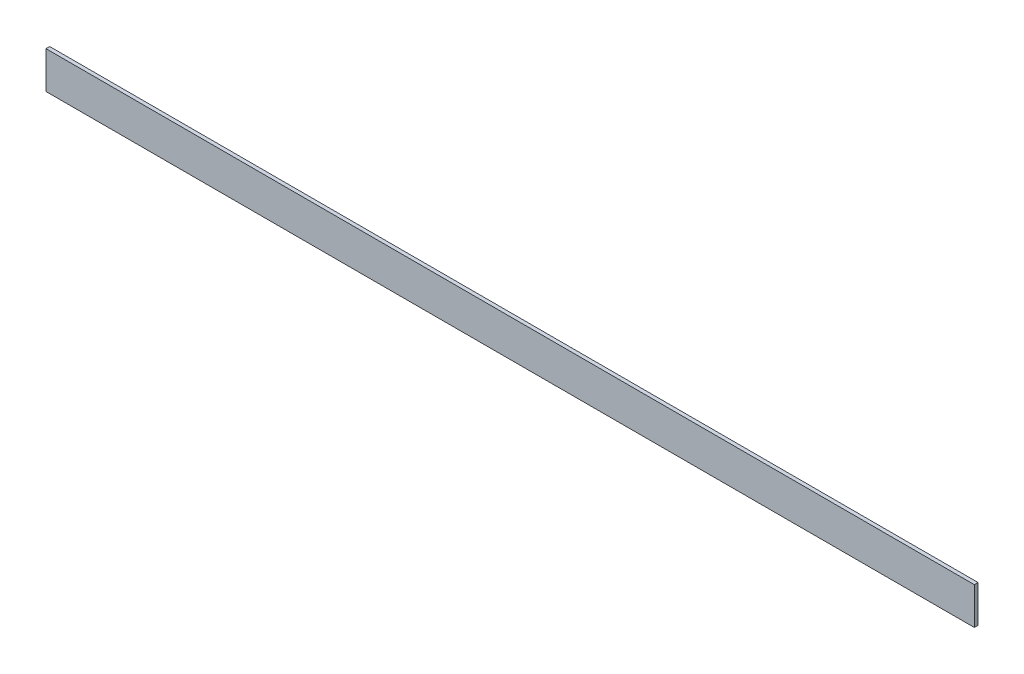
ISO-10303-21;
HEADER;
FILE_DESCRIPTION(('STEP AP214'),'2;1');
FILE_NAME('part.step','',(''),(''),'','','');
FILE_SCHEMA(('AUTOMOTIVE_DESIGN { 1 0 10303 214 1 1 1 1 }'));
ENDSEC;
DATA;
#1=APPLICATION_CONTEXT('core data for automotive mechanical design processes');
#2=APPLICATION_PROTOCOL_DEFINITION('international standard','automotive_design',2000,#1);
#3=PRODUCT_CONTEXT('',#1,'mechanical');
#4=PRODUCT('Part','Part','',(#3));
#5=PRODUCT_RELATED_PRODUCT_CATEGORY('part','',(#4));
#6=PRODUCT_DEFINITION_FORMATION('','',#4);
#7=PRODUCT_DEFINITION_CONTEXT('part definition',#1,'design');
#8=PRODUCT_DEFINITION('design','',#6,#7);
#9=PRODUCT_DEFINITION_SHAPE('','',#8);
#10=(LENGTH_UNIT() NAMED_UNIT(*) SI_UNIT(.MILLI.,.METRE.));
#11=(NAMED_UNIT(*) PLANE_ANGLE_UNIT() SI_UNIT($,.RADIAN.));
#12=(NAMED_UNIT(*) SI_UNIT($,.STERADIAN.) SOLID_ANGLE_UNIT());
#13=UNCERTAINTY_MEASURE_WITH_UNIT(LENGTH_MEASURE(1.E-05),#10,'distance_accuracy_value','');
#14=(GEOMETRIC_REPRESENTATION_CONTEXT(3) GLOBAL_UNCERTAINTY_ASSIGNED_CONTEXT((#13)) GLOBAL_UNIT_ASSIGNED_CONTEXT((#10,
#11,#12)) REPRESENTATION_CONTEXT('',''));
#15=CARTESIAN_POINT('',(0.,0.,0.));
#16=DIRECTION('',(0.,0.,1.));
#17=DIRECTION('',(1.,0.,0.));
#18=AXIS2_PLACEMENT_3D('',#15,#16,#17);
#19=CARTESIAN_POINT('',(0.,0.,0.5));
#20=DIRECTION('',(1.,0.,0.));
#21=DIRECTION('',(0.,0.,-1.));
#22=AXIS2_PLACEMENT_3D('',#19,#20,#21);
#23=PLANE('',#22);
#24=DIRECTION('',(0.,-1.,0.));
#25=VECTOR('',#24,1.);
#26=CARTESIAN_POINT('',(0.,0.,0.));
#27=LINE('',#26,#25);
#28=CARTESIAN_POINT('',(0.,5.,0.));
#29=VERTEX_POINT('',#28);
#30=CARTESIAN_POINT('',(0.,0.,0.));
#31=VERTEX_POINT('',#30);
#32=EDGE_CURVE('E108',#29,#31,#27,.T.);
#33=ORIENTED_EDGE('',*,*,#32,.T.);
#34=DIRECTION('',(0.,0.,-1.));
#35=VECTOR('',#34,1.);
#36=CARTESIAN_POINT('',(0.,0.,0.5));
#37=LINE('',#36,#35);
#38=CARTESIAN_POINT('',(0.,0.,0.5));
#39=VERTEX_POINT('',#38);
#40=EDGE_CURVE('E11',#39,#31,#37,.T.);
#41=ORIENTED_EDGE('',*,*,#40,.F.);
#42=DIRECTION('',(0.,-1.,0.));
#43=VECTOR('',#42,1.);
#44=CARTESIAN_POINT('',(0.,0.,0.5));
#45=LINE('',#44,#43);
#46=CARTESIAN_POINT('',(0.,5.,0.5));
#47=VERTEX_POINT('',#46);
#48=EDGE_CURVE('E92',#47,#39,#45,.T.);
#49=ORIENTED_EDGE('',*,*,#48,.F.);
#50=DIRECTION('',(0.,0.,-1.));
#51=VECTOR('',#50,1.);
#52=CARTESIAN_POINT('',(0.,5.,0.5));
#53=LINE('',#52,#51);
#54=EDGE_CURVE('E105',#47,#29,#53,.T.);
#55=ORIENTED_EDGE('',*,*,#54,.T.);
#56=EDGE_LOOP('',(#33,#41,#49,#55));
#57=FACE_BOUND('',#56,.T.);
#58=ADVANCED_FACE('F43',(#57),#23,.F.);
#59=CARTESIAN_POINT('',(0.,0.,0.5));
#60=DIRECTION('',(0.,1.,0.));
#61=DIRECTION('',(0.,0.,1.));
#62=AXIS2_PLACEMENT_3D('',#59,#60,#61);
#63=PLANE('',#62);
#64=DIRECTION('',(1.,0.,0.));
#65=VECTOR('',#64,1.);
#66=CARTESIAN_POINT('',(0.,0.,0.));
#67=LINE('',#66,#65);
#68=CARTESIAN_POINT('',(125.,0.,0.));
#69=VERTEX_POINT('',#68);
#70=EDGE_CURVE('E97',#31,#69,#67,.T.);
#71=ORIENTED_EDGE('',*,*,#70,.T.);
#72=DIRECTION('',(0.,0.,-1.));
#73=VECTOR('',#72,1.);
#74=CARTESIAN_POINT('',(125.,0.,0.5));
#75=LINE('',#74,#73);
#76=CARTESIAN_POINT('',(125.,0.,0.5));
#77=VERTEX_POINT('',#76);
#78=EDGE_CURVE('E51',#77,#69,#75,.T.);
#79=ORIENTED_EDGE('',*,*,#78,.F.);
#80=DIRECTION('',(1.,0.,0.));
#81=VECTOR('',#80,1.);
#82=CARTESIAN_POINT('',(0.,0.,0.5));
#83=LINE('',#82,#81);
#84=EDGE_CURVE('E87',#39,#77,#83,.T.);
#85=ORIENTED_EDGE('',*,*,#84,.F.);
#86=ORIENTED_EDGE('',*,*,#40,.T.);
#87=EDGE_LOOP('',(#71,#79,#85,#86));
#88=FACE_BOUND('',#87,.T.);
#89=ADVANCED_FACE('F100',(#88),#63,.F.);
#90=CARTESIAN_POINT('',(125.,0.,0.5));
#91=DIRECTION('',(-1.,0.,0.));
#92=DIRECTION('',(0.,0.,1.));
#93=AXIS2_PLACEMENT_3D('',#90,#91,#92);
#94=PLANE('',#93);
#95=DIRECTION('',(0.,1.,0.));
#96=VECTOR('',#95,1.);
#97=CARTESIAN_POINT('',(125.,0.,0.));
#98=LINE('',#97,#96);
#99=CARTESIAN_POINT('',(125.,5.,0.));
#100=VERTEX_POINT('',#99);
#101=EDGE_CURVE('E78',#69,#100,#98,.T.);
#102=ORIENTED_EDGE('',*,*,#101,.T.);
#103=DIRECTION('',(0.,0.,-1.));
#104=VECTOR('',#103,1.);
#105=CARTESIAN_POINT('',(125.,5.,0.5));
#106=LINE('',#105,#104);
#107=CARTESIAN_POINT('',(125.,5.,0.5));
#108=VERTEX_POINT('',#107);
#109=EDGE_CURVE('E98',#108,#100,#106,.T.);
#110=ORIENTED_EDGE('',*,*,#109,.F.);
#111=DIRECTION('',(0.,1.,0.));
#112=VECTOR('',#111,1.);
#113=CARTESIAN_POINT('',(125.,0.,0.5));
#114=LINE('',#113,#112);
#115=EDGE_CURVE('E95',#77,#108,#114,.T.);
#116=ORIENTED_EDGE('',*,*,#115,.F.);
#117=ORIENTED_EDGE('',*,*,#78,.T.);
#118=EDGE_LOOP('',(#102,#110,#116,#117));
#119=FACE_BOUND('',#118,.T.);
#120=ADVANCED_FACE('F99',(#119),#94,.F.);
#121=CARTESIAN_POINT('',(0.,5.,0.5));
#122=DIRECTION('',(0.,-1.,0.));
#123=DIRECTION('',(0.,0.,-1.));
#124=AXIS2_PLACEMENT_3D('',#121,#122,#123);
#125=PLANE('',#124);
#126=DIRECTION('',(-1.,0.,0.));
#127=VECTOR('',#126,1.);
#128=CARTESIAN_POINT('',(0.,5.,0.));
#129=LINE('',#128,#127);
#130=EDGE_CURVE('E85',#100,#29,#129,.T.);
#131=ORIENTED_EDGE('',*,*,#130,.T.);
#132=ORIENTED_EDGE('',*,*,#54,.F.);
#133=DIRECTION('',(-1.,0.,0.));
#134=VECTOR('',#133,1.);
#135=CARTESIAN_POINT('',(0.,5.,0.5));
#136=LINE('',#135,#134);
#137=EDGE_CURVE('E56',#108,#47,#136,.T.);
#138=ORIENTED_EDGE('',*,*,#137,.F.);
#139=ORIENTED_EDGE('',*,*,#109,.T.);
#140=EDGE_LOOP('',(#131,#132,#138,#139));
#141=FACE_BOUND('',#140,.T.);
#142=ADVANCED_FACE('F111',(#141),#125,.F.);
#143=CARTESIAN_POINT('',(0.,0.,0.5));
#144=DIRECTION('',(0.,0.,-1.));
#145=DIRECTION('',(-1.,0.,0.));
#146=AXIS2_PLACEMENT_3D('',#143,#144,#145);
#147=PLANE('',#146);
#148=ORIENTED_EDGE('',*,*,#48,.T.);
#149=ORIENTED_EDGE('',*,*,#84,.T.);
#150=ORIENTED_EDGE('',*,*,#115,.T.);
#151=ORIENTED_EDGE('',*,*,#137,.T.);
#152=EDGE_LOOP('',(#148,#149,#150,#151));
#153=FACE_BOUND('',#152,.T.);
#154=ADVANCED_FACE('F89',(#153),#147,.F.);
#155=CARTESIAN_POINT('',(0.,0.,0.));
#156=DIRECTION('',(0.,0.,-1.));
#157=DIRECTION('',(-1.,0.,0.));
#158=AXIS2_PLACEMENT_3D('',#155,#156,#157);
#159=PLANE('',#158);
#160=ORIENTED_EDGE('',*,*,#32,.F.);
#161=ORIENTED_EDGE('',*,*,#130,.F.);
#162=ORIENTED_EDGE('',*,*,#101,.F.);
#163=ORIENTED_EDGE('',*,*,#70,.F.);
#164=EDGE_LOOP('',(#160,#161,#162,#163));
#165=FACE_BOUND('',#164,.T.);
#166=ADVANCED_FACE('F118',(#165),#159,.T.);
#167=CLOSED_SHELL('',(#58,#89,#120,#142,#154,#166));
#168=MANIFOLD_SOLID_BREP('B2',#167);
#169=ADVANCED_BREP_SHAPE_REPRESENTATION('',(#18,#168),#14);
#170=SHAPE_DEFINITION_REPRESENTATION(#9,#169);
ENDSEC;
END-ISO-10303-21;
